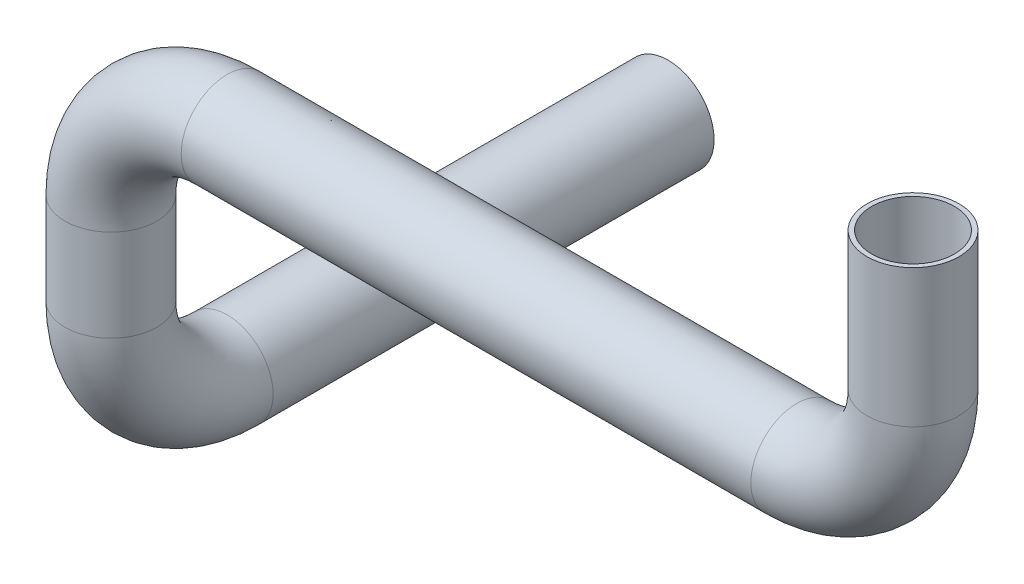
ISO-10303-21;
HEADER;
FILE_DESCRIPTION(('STEP AP214'),'2;1');
FILE_NAME('part.step','',(''),(''),'','','');
FILE_SCHEMA(('AUTOMOTIVE_DESIGN { 1 0 10303 214 1 1 1 1 }'));
ENDSEC;
DATA;
#1=APPLICATION_CONTEXT('core data for automotive mechanical design processes');
#2=APPLICATION_PROTOCOL_DEFINITION('international standard','automotive_design',2000,#1);
#3=PRODUCT_CONTEXT('',#1,'mechanical');
#4=PRODUCT('Part','Part','',(#3));
#5=PRODUCT_RELATED_PRODUCT_CATEGORY('part','',(#4));
#6=PRODUCT_DEFINITION_FORMATION('','',#4);
#7=PRODUCT_DEFINITION_CONTEXT('part definition',#1,'design');
#8=PRODUCT_DEFINITION('design','',#6,#7);
#9=PRODUCT_DEFINITION_SHAPE('','',#8);
#10=(LENGTH_UNIT() NAMED_UNIT(*) SI_UNIT(.MILLI.,.METRE.));
#11=(NAMED_UNIT(*) PLANE_ANGLE_UNIT() SI_UNIT($,.RADIAN.));
#12=(NAMED_UNIT(*) SI_UNIT($,.STERADIAN.) SOLID_ANGLE_UNIT());
#13=UNCERTAINTY_MEASURE_WITH_UNIT(LENGTH_MEASURE(1.E-05),#10,'distance_accuracy_value','');
#14=(GEOMETRIC_REPRESENTATION_CONTEXT(3) GLOBAL_UNCERTAINTY_ASSIGNED_CONTEXT((#13)) GLOBAL_UNIT_ASSIGNED_CONTEXT((#10,
#11,#12)) REPRESENTATION_CONTEXT('',''));
#15=CARTESIAN_POINT('',(0.,0.,0.));
#16=DIRECTION('',(0.,0.,1.));
#17=DIRECTION('',(1.,0.,0.));
#18=AXIS2_PLACEMENT_3D('',#15,#16,#17);
#19=CARTESIAN_POINT('',(87.3,50.3,0.));
#20=DIRECTION('',(0.,1.,0.));
#21=DIRECTION('',(0.,0.,1.));
#22=AXIS2_PLACEMENT_3D('',#19,#20,#21);
#23=PLANE('',#22);
#24=CARTESIAN_POINT('',(87.3,50.3,0.));
#25=DIRECTION('',(0.,1.,0.));
#26=DIRECTION('',(0.,0.,1.));
#27=AXIS2_PLACEMENT_3D('',#24,#25,#26);
#28=CIRCLE('',#27,4.5);
#29=CARTESIAN_POINT('',(87.3,50.3,4.5));
#30=VERTEX_POINT('',#29);
#31=EDGE_CURVE('E68',#30,#30,#28,.T.);
#32=ORIENTED_EDGE('',*,*,#31,.F.);
#33=EDGE_LOOP('',(#32));
#34=FACE_BOUND('',#33,.T.);
#35=CARTESIAN_POINT('',(87.3,50.3,0.));
#36=DIRECTION('',(0.,1.,0.));
#37=DIRECTION('',(0.,0.,1.));
#38=AXIS2_PLACEMENT_3D('',#35,#36,#37);
#39=CIRCLE('',#38,5.);
#40=CARTESIAN_POINT('',(87.3,50.3,5.));
#41=VERTEX_POINT('',#40);
#42=EDGE_CURVE('E10',#41,#41,#39,.T.);
#43=ORIENTED_EDGE('',*,*,#42,.T.);
#44=EDGE_LOOP('',(#43));
#45=FACE_BOUND('',#44,.T.);
#46=ADVANCED_FACE('F37',(#34,#45),#23,.T.);
#47=CARTESIAN_POINT('',(0.,0.,0.));
#48=DIRECTION('',(0.,1.,0.));
#49=DIRECTION('',(0.,0.,1.));
#50=AXIS2_PLACEMENT_3D('',#47,#48,#49);
#51=CYLINDRICAL_SURFACE('',#50,5.);
#52=CARTESIAN_POINT('',(0.,10.,0.));
#53=DIRECTION('',(0.,1.,0.));
#54=DIRECTION('',(0.,0.,1.));
#55=AXIS2_PLACEMENT_3D('',#52,#53,#54);
#56=CIRCLE('',#55,5.);
#57=CARTESIAN_POINT('',(-5.,10.,0.));
#58=VERTEX_POINT('',#57);
#59=EDGE_CURVE('E56',#58,#58,#56,.T.);
#60=ORIENTED_EDGE('',*,*,#59,.F.);
#61=EDGE_LOOP('',(#60));
#62=FACE_BOUND('',#61,.T.);
#63=CARTESIAN_POINT('',(0.,0.,0.));
#64=DIRECTION('',(0.,-1.,0.));
#65=DIRECTION('',(0.,0.,-1.));
#66=AXIS2_PLACEMENT_3D('',#63,#64,#65);
#67=CIRCLE('',#66,5.);
#68=CARTESIAN_POINT('',(0.,0.,5.));
#69=VERTEX_POINT('',#68);
#70=EDGE_CURVE('E65',#69,#69,#67,.T.);
#71=ORIENTED_EDGE('',*,*,#70,.F.);
#72=EDGE_LOOP('',(#71));
#73=FACE_BOUND('',#72,.T.);
#74=ADVANCED_FACE('F135',(#62,#73),#51,.T.);
#75=CARTESIAN_POINT('',(12.65,10.,0.));
#76=DIRECTION('',(0.,0.,-1.));
#77=DIRECTION('',(-1.,0.,0.));
#78=AXIS2_PLACEMENT_3D('',#75,#76,#77);
#79=TOROIDAL_SURFACE('',#78,12.65,5.);
#80=CARTESIAN_POINT('',(12.65,22.65,0.));
#81=DIRECTION('',(1.,0.,0.));
#82=DIRECTION('',(0.,0.,1.));
#83=AXIS2_PLACEMENT_3D('',#80,#81,#82);
#84=CIRCLE('',#83,5.);
#85=CARTESIAN_POINT('',(12.65,27.65,0.));
#86=VERTEX_POINT('',#85);
#87=EDGE_CURVE('E51',#86,#86,#84,.T.);
#88=CARTESIAN_POINT('',(12.65,10.,0.));
#89=DIRECTION('',(0.,0.,-1.));
#90=DIRECTION('',(-1.,0.,0.));
#91=AXIS2_PLACEMENT_3D('',#88,#89,#90);
#92=CIRCLE('',#91,17.65);
#93=EDGE_CURVE('',#58,#86,#92,.T.);
#94=ORIENTED_EDGE('',*,*,#59,.T.);
#95=ORIENTED_EDGE('',*,*,#87,.F.);
#96=ORIENTED_EDGE('',*,*,#93,.T.);
#97=ORIENTED_EDGE('',*,*,#93,.F.);
#98=EDGE_LOOP('',(#94,#96,#95,#97));
#99=FACE_BOUND('',#98,.T.);
#100=ADVANCED_FACE('F131',(#99),#79,.T.);
#101=CARTESIAN_POINT('',(12.65,22.65,0.));
#102=DIRECTION('',(1.,0.,0.));
#103=DIRECTION('',(0.,0.,-1.));
#104=AXIS2_PLACEMENT_3D('',#101,#102,#103);
#105=CYLINDRICAL_SURFACE('',#104,5.);
#106=CARTESIAN_POINT('',(74.65,22.65,0.));
#107=DIRECTION('',(1.,0.,0.));
#108=DIRECTION('',(0.,0.,1.));
#109=AXIS2_PLACEMENT_3D('',#106,#107,#108);
#110=CIRCLE('',#109,5.);
#111=CARTESIAN_POINT('',(74.65,17.65,0.));
#112=VERTEX_POINT('',#111);
#113=EDGE_CURVE('E47',#112,#112,#110,.T.);
#114=ORIENTED_EDGE('',*,*,#113,.F.);
#115=EDGE_LOOP('',(#114));
#116=FACE_BOUND('',#115,.T.);
#117=ORIENTED_EDGE('',*,*,#87,.T.);
#118=EDGE_LOOP('',(#117));
#119=FACE_BOUND('',#118,.T.);
#120=ADVANCED_FACE('F125',(#116,#119),#105,.T.);
#121=CARTESIAN_POINT('',(74.65,35.3,0.));
#122=DIRECTION('',(0.,0.,1.));
#123=DIRECTION('',(1.,0.,0.));
#124=AXIS2_PLACEMENT_3D('',#121,#122,#123);
#125=TOROIDAL_SURFACE('',#124,12.65,5.);
#126=CARTESIAN_POINT('',(87.3,35.3,0.));
#127=DIRECTION('',(0.,1.,0.));
#128=DIRECTION('',(0.,0.,1.));
#129=AXIS2_PLACEMENT_3D('',#126,#127,#128);
#130=CIRCLE('',#129,5.);
#131=CARTESIAN_POINT('',(92.3,35.3,0.));
#132=VERTEX_POINT('',#131);
#133=EDGE_CURVE('E43',#132,#132,#130,.T.);
#134=CARTESIAN_POINT('',(74.65,35.3,0.));
#135=DIRECTION('',(0.,0.,1.));
#136=DIRECTION('',(1.,0.,0.));
#137=AXIS2_PLACEMENT_3D('',#134,#135,#136);
#138=CIRCLE('',#137,17.65);
#139=EDGE_CURVE('',#112,#132,#138,.T.);
#140=ORIENTED_EDGE('',*,*,#113,.T.);
#141=ORIENTED_EDGE('',*,*,#133,.F.);
#142=ORIENTED_EDGE('',*,*,#139,.T.);
#143=ORIENTED_EDGE('',*,*,#139,.F.);
#144=EDGE_LOOP('',(#140,#142,#141,#143));
#145=FACE_BOUND('',#144,.T.);
#146=ADVANCED_FACE('F114',(#145),#125,.T.);
#147=CARTESIAN_POINT('',(87.3,35.3,0.));
#148=DIRECTION('',(0.,1.,0.));
#149=DIRECTION('',(0.,0.,1.));
#150=AXIS2_PLACEMENT_3D('',#147,#148,#149);
#151=CYLINDRICAL_SURFACE('',#150,5.);
#152=ORIENTED_EDGE('',*,*,#42,.F.);
#153=EDGE_LOOP('',(#152));
#154=FACE_BOUND('',#153,.T.);
#155=ORIENTED_EDGE('',*,*,#133,.T.);
#156=EDGE_LOOP('',(#155));
#157=FACE_BOUND('',#156,.T.);
#158=ADVANCED_FACE('F111',(#154,#157),#151,.T.);
#159=CARTESIAN_POINT('',(0.,-12.65,-60.65));
#160=DIRECTION('',(0.,0.,-1.));
#161=DIRECTION('',(0.,1.,0.));
#162=AXIS2_PLACEMENT_3D('',#159,#160,#161);
#163=PLANE('',#162);
#164=CARTESIAN_POINT('',(0.,-12.65,-60.65));
#165=DIRECTION('',(0.,0.,-1.));
#166=DIRECTION('',(0.,1.,0.));
#167=AXIS2_PLACEMENT_3D('',#164,#165,#166);
#168=CIRCLE('',#167,4.5);
#169=CARTESIAN_POINT('',(0.,-8.15,-60.65));
#170=VERTEX_POINT('',#169);
#171=EDGE_CURVE('E69',#170,#170,#168,.T.);
#172=ORIENTED_EDGE('',*,*,#171,.F.);
#173=EDGE_LOOP('',(#172));
#174=FACE_BOUND('',#173,.T.);
#175=CARTESIAN_POINT('',(0.,-12.65,-60.65));
#176=DIRECTION('',(0.,0.,-1.));
#177=DIRECTION('',(0.,1.,0.));
#178=AXIS2_PLACEMENT_3D('',#175,#176,#177);
#179=CIRCLE('',#178,5.);
#180=CARTESIAN_POINT('',(0.,-7.65,-60.65));
#181=VERTEX_POINT('',#180);
#182=EDGE_CURVE('E59',#181,#181,#179,.T.);
#183=ORIENTED_EDGE('',*,*,#182,.T.);
#184=EDGE_LOOP('',(#183));
#185=FACE_BOUND('',#184,.T.);
#186=ADVANCED_FACE('F113',(#174,#185),#163,.T.);
#187=CARTESIAN_POINT('',(0.,0.,-12.65));
#188=DIRECTION('',(1.,0.,0.));
#189=DIRECTION('',(0.,0.,-1.));
#190=AXIS2_PLACEMENT_3D('',#187,#188,#189);
#191=TOROIDAL_SURFACE('',#190,12.65,5.);
#192=CARTESIAN_POINT('',(0.,-12.65,-12.65));
#193=DIRECTION('',(0.,0.,-1.));
#194=DIRECTION('',(0.,1.,0.));
#195=AXIS2_PLACEMENT_3D('',#192,#193,#194);
#196=CIRCLE('',#195,5.);
#197=CARTESIAN_POINT('',(0.,-17.65,-12.65));
#198=VERTEX_POINT('',#197);
#199=EDGE_CURVE('E62',#198,#198,#196,.T.);
#200=CARTESIAN_POINT('',(0.,0.,-12.65));
#201=DIRECTION('',(1.,0.,0.));
#202=DIRECTION('',(0.,0.,-1.));
#203=AXIS2_PLACEMENT_3D('',#200,#201,#202);
#204=CIRCLE('',#203,17.65);
#205=EDGE_CURVE('',#69,#198,#204,.T.);
#206=ORIENTED_EDGE('',*,*,#70,.T.);
#207=ORIENTED_EDGE('',*,*,#199,.F.);
#208=ORIENTED_EDGE('',*,*,#205,.T.);
#209=ORIENTED_EDGE('',*,*,#205,.F.);
#210=EDGE_LOOP('',(#206,#208,#207,#209));
#211=FACE_BOUND('',#210,.T.);
#212=ADVANCED_FACE('F121',(#211),#191,.T.);
#213=CARTESIAN_POINT('',(0.,-12.65,-12.65));
#214=DIRECTION('',(0.,0.,-1.));
#215=DIRECTION('',(-1.,0.,0.));
#216=AXIS2_PLACEMENT_3D('',#213,#214,#215);
#217=CYLINDRICAL_SURFACE('',#216,5.);
#218=ORIENTED_EDGE('',*,*,#182,.F.);
#219=EDGE_LOOP('',(#218));
#220=FACE_BOUND('',#219,.T.);
#221=ORIENTED_EDGE('',*,*,#199,.T.);
#222=EDGE_LOOP('',(#221));
#223=FACE_BOUND('',#222,.T.);
#224=ADVANCED_FACE('F108',(#220,#223),#217,.T.);
#225=CARTESIAN_POINT('',(0.,0.,0.));
#226=DIRECTION('',(0.,1.,0.));
#227=DIRECTION('',(0.,0.,1.));
#228=AXIS2_PLACEMENT_3D('',#225,#226,#227);
#229=CYLINDRICAL_SURFACE('',#228,4.5);
#230=CARTESIAN_POINT('',(0.,10.,0.));
#231=DIRECTION('',(0.,-1.,0.));
#232=DIRECTION('',(0.,0.,-1.));
#233=AXIS2_PLACEMENT_3D('',#230,#231,#232);
#234=CIRCLE('',#233,4.5);
#235=CARTESIAN_POINT('',(-4.5,10.,0.));
#236=VERTEX_POINT('',#235);
#237=EDGE_CURVE('E72',#236,#236,#234,.F.);
#238=ORIENTED_EDGE('',*,*,#237,.T.);
#239=EDGE_LOOP('',(#238));
#240=FACE_BOUND('',#239,.T.);
#241=CARTESIAN_POINT('',(0.,0.,0.));
#242=DIRECTION('',(0.,1.,0.));
#243=DIRECTION('',(0.,0.,1.));
#244=AXIS2_PLACEMENT_3D('',#241,#242,#243);
#245=CIRCLE('',#244,4.5);
#246=CARTESIAN_POINT('',(0.,0.,4.5));
#247=VERTEX_POINT('',#246);
#248=EDGE_CURVE('E79',#247,#247,#245,.F.);
#249=ORIENTED_EDGE('',*,*,#248,.T.);
#250=EDGE_LOOP('',(#249));
#251=FACE_BOUND('',#250,.T.);
#252=ADVANCED_FACE('F93',(#240,#251),#229,.F.);
#253=CARTESIAN_POINT('',(12.65,10.,0.));
#254=DIRECTION('',(0.,0.,-1.));
#255=DIRECTION('',(-1.,0.,0.));
#256=AXIS2_PLACEMENT_3D('',#253,#254,#255);
#257=TOROIDAL_SURFACE('',#256,12.65,4.5);
#258=CARTESIAN_POINT('',(12.65,22.65,0.));
#259=DIRECTION('',(1.,0.,0.));
#260=DIRECTION('',(0.,0.,-1.));
#261=AXIS2_PLACEMENT_3D('',#258,#259,#260);
#262=CIRCLE('',#261,4.5);
#263=CARTESIAN_POINT('',(12.65,27.15,0.));
#264=VERTEX_POINT('',#263);
#265=EDGE_CURVE('E85',#264,#264,#262,.T.);
#266=CARTESIAN_POINT('',(12.65,10.,0.));
#267=DIRECTION('',(0.,0.,-1.));
#268=DIRECTION('',(-1.,0.,0.));
#269=AXIS2_PLACEMENT_3D('',#266,#267,#268);
#270=CIRCLE('',#269,17.15);
#271=EDGE_CURVE('',#236,#264,#270,.T.);
#272=ORIENTED_EDGE('',*,*,#237,.F.);
#273=ORIENTED_EDGE('',*,*,#265,.T.);
#274=ORIENTED_EDGE('',*,*,#271,.T.);
#275=ORIENTED_EDGE('',*,*,#271,.F.);
#276=EDGE_LOOP('',(#272,#274,#273,#275));
#277=FACE_BOUND('',#276,.T.);
#278=ADVANCED_FACE('F96',(#277),#257,.F.);
#279=CARTESIAN_POINT('',(12.65,22.65,0.));
#280=DIRECTION('',(1.,0.,0.));
#281=DIRECTION('',(0.,0.,-1.));
#282=AXIS2_PLACEMENT_3D('',#279,#280,#281);
#283=CYLINDRICAL_SURFACE('',#282,4.5);
#284=CARTESIAN_POINT('',(74.65,22.65,0.));
#285=DIRECTION('',(-1.,0.,0.));
#286=DIRECTION('',(0.,-1.,0.));
#287=AXIS2_PLACEMENT_3D('',#284,#285,#286);
#288=CIRCLE('',#287,4.5);
#289=CARTESIAN_POINT('',(74.65,18.15,0.));
#290=VERTEX_POINT('',#289);
#291=EDGE_CURVE('E82',#290,#290,#288,.F.);
#292=ORIENTED_EDGE('',*,*,#291,.T.);
#293=EDGE_LOOP('',(#292));
#294=FACE_BOUND('',#293,.T.);
#295=ORIENTED_EDGE('',*,*,#265,.F.);
#296=EDGE_LOOP('',(#295));
#297=FACE_BOUND('',#296,.T.);
#298=ADVANCED_FACE('F98',(#294,#297),#283,.F.);
#299=CARTESIAN_POINT('',(74.65,35.3,0.));
#300=DIRECTION('',(0.,0.,1.));
#301=DIRECTION('',(1.,0.,0.));
#302=AXIS2_PLACEMENT_3D('',#299,#300,#301);
#303=TOROIDAL_SURFACE('',#302,12.65,4.5);
#304=CARTESIAN_POINT('',(87.3,35.3,0.));
#305=DIRECTION('',(0.,1.,0.));
#306=DIRECTION('',(0.,0.,1.));
#307=AXIS2_PLACEMENT_3D('',#304,#305,#306);
#308=CIRCLE('',#307,4.5);
#309=CARTESIAN_POINT('',(91.8,35.3,0.));
#310=VERTEX_POINT('',#309);
#311=EDGE_CURVE('E76',#310,#310,#308,.T.);
#312=CARTESIAN_POINT('',(74.65,35.3,0.));
#313=DIRECTION('',(0.,0.,1.));
#314=DIRECTION('',(1.,0.,0.));
#315=AXIS2_PLACEMENT_3D('',#312,#313,#314);
#316=CIRCLE('',#315,17.15);
#317=EDGE_CURVE('',#290,#310,#316,.T.);
#318=ORIENTED_EDGE('',*,*,#291,.F.);
#319=ORIENTED_EDGE('',*,*,#311,.T.);
#320=ORIENTED_EDGE('',*,*,#317,.T.);
#321=ORIENTED_EDGE('',*,*,#317,.F.);
#322=EDGE_LOOP('',(#318,#320,#319,#321));
#323=FACE_BOUND('',#322,.T.);
#324=ADVANCED_FACE('F105',(#323),#303,.F.);
#325=CARTESIAN_POINT('',(87.3,35.3,0.));
#326=DIRECTION('',(0.,1.,0.));
#327=DIRECTION('',(0.,0.,1.));
#328=AXIS2_PLACEMENT_3D('',#325,#326,#327);
#329=CYLINDRICAL_SURFACE('',#328,4.5);
#330=ORIENTED_EDGE('',*,*,#31,.T.);
#331=EDGE_LOOP('',(#330));
#332=FACE_BOUND('',#331,.T.);
#333=ORIENTED_EDGE('',*,*,#311,.F.);
#334=EDGE_LOOP('',(#333));
#335=FACE_BOUND('',#334,.T.);
#336=ADVANCED_FACE('F124',(#332,#335),#329,.F.);
#337=CARTESIAN_POINT('',(0.,0.,-12.65));
#338=DIRECTION('',(1.,0.,0.));
#339=DIRECTION('',(0.,0.,-1.));
#340=AXIS2_PLACEMENT_3D('',#337,#338,#339);
#341=TOROIDAL_SURFACE('',#340,12.65,4.5);
#342=CARTESIAN_POINT('',(0.,-12.65,-12.65));
#343=DIRECTION('',(0.,0.,-1.));
#344=DIRECTION('',(-1.,0.,0.));
#345=AXIS2_PLACEMENT_3D('',#342,#343,#344);
#346=CIRCLE('',#345,4.5);
#347=CARTESIAN_POINT('',(0.,-17.15,-12.65));
#348=VERTEX_POINT('',#347);
#349=EDGE_CURVE('E73',#348,#348,#346,.T.);
#350=CARTESIAN_POINT('',(0.,0.,-12.65));
#351=DIRECTION('',(1.,0.,0.));
#352=DIRECTION('',(0.,0.,-1.));
#353=AXIS2_PLACEMENT_3D('',#350,#351,#352);
#354=CIRCLE('',#353,17.15);
#355=EDGE_CURVE('',#247,#348,#354,.T.);
#356=ORIENTED_EDGE('',*,*,#248,.F.);
#357=ORIENTED_EDGE('',*,*,#349,.T.);
#358=ORIENTED_EDGE('',*,*,#355,.T.);
#359=ORIENTED_EDGE('',*,*,#355,.F.);
#360=EDGE_LOOP('',(#356,#358,#357,#359));
#361=FACE_BOUND('',#360,.T.);
#362=ADVANCED_FACE('F147',(#361),#341,.F.);
#363=CARTESIAN_POINT('',(0.,-12.65,-12.65));
#364=DIRECTION('',(0.,0.,-1.));
#365=DIRECTION('',(-1.,0.,0.));
#366=AXIS2_PLACEMENT_3D('',#363,#364,#365);
#367=CYLINDRICAL_SURFACE('',#366,4.5);
#368=ORIENTED_EDGE('',*,*,#171,.T.);
#369=EDGE_LOOP('',(#368));
#370=FACE_BOUND('',#369,.T.);
#371=ORIENTED_EDGE('',*,*,#349,.F.);
#372=EDGE_LOOP('',(#371));
#373=FACE_BOUND('',#372,.T.);
#374=ADVANCED_FACE('F110',(#370,#373),#367,.F.);
#375=CLOSED_SHELL('',(#46,#74,#100,#120,#146,#158,#186,#212,#224,#252,#278,#298,#324,#336,#362,#374));
#376=MANIFOLD_SOLID_BREP('B2',#375);
#377=ADVANCED_BREP_SHAPE_REPRESENTATION('',(#18,#376),#14);
#378=SHAPE_DEFINITION_REPRESENTATION(#9,#377);
ENDSEC;
END-ISO-10303-21;
